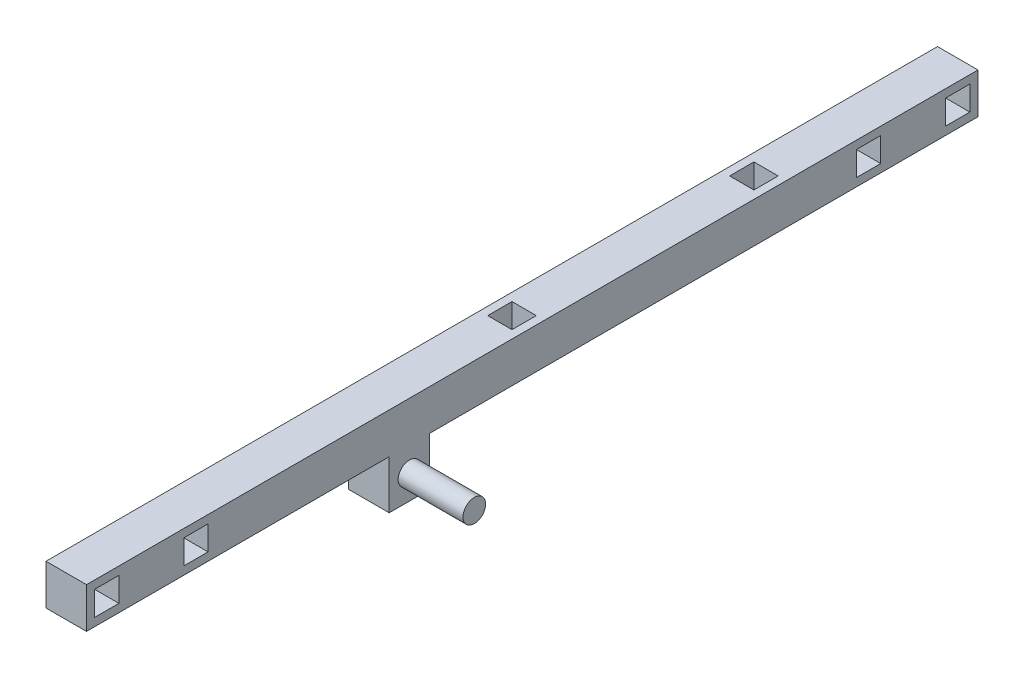
ISO-10303-21;
HEADER;
FILE_DESCRIPTION(('STEP AP214'),'2;1');
FILE_NAME('part.step','',(''),(''),'','','');
FILE_SCHEMA(('AUTOMOTIVE_DESIGN { 1 0 10303 214 1 1 1 1 }'));
ENDSEC;
DATA;
#1=APPLICATION_CONTEXT('core data for automotive mechanical design processes');
#2=APPLICATION_PROTOCOL_DEFINITION('international standard','automotive_design',2000,#1);
#3=PRODUCT_CONTEXT('',#1,'mechanical');
#4=PRODUCT('Part','Part','',(#3));
#5=PRODUCT_RELATED_PRODUCT_CATEGORY('part','',(#4));
#6=PRODUCT_DEFINITION_FORMATION('','',#4);
#7=PRODUCT_DEFINITION_CONTEXT('part definition',#1,'design');
#8=PRODUCT_DEFINITION('design','',#6,#7);
#9=PRODUCT_DEFINITION_SHAPE('','',#8);
#10=(LENGTH_UNIT() NAMED_UNIT(*) SI_UNIT(.MILLI.,.METRE.));
#11=(NAMED_UNIT(*) PLANE_ANGLE_UNIT() SI_UNIT($,.RADIAN.));
#12=(NAMED_UNIT(*) SI_UNIT($,.STERADIAN.) SOLID_ANGLE_UNIT());
#13=UNCERTAINTY_MEASURE_WITH_UNIT(LENGTH_MEASURE(1.E-05),#10,'distance_accuracy_value','');
#14=(GEOMETRIC_REPRESENTATION_CONTEXT(3) GLOBAL_UNCERTAINTY_ASSIGNED_CONTEXT((#13)) GLOBAL_UNIT_ASSIGNED_CONTEXT((#10,
#11,#12)) REPRESENTATION_CONTEXT('',''));
#15=CARTESIAN_POINT('',(0.,0.,0.));
#16=DIRECTION('',(0.,0.,1.));
#17=DIRECTION('',(1.,0.,0.));
#18=AXIS2_PLACEMENT_3D('',#15,#16,#17);
#19=CARTESIAN_POINT('',(0.,0.,110.));
#20=DIRECTION('',(0.,1.,0.));
#21=DIRECTION('',(0.,0.,1.));
#22=AXIS2_PLACEMENT_3D('',#19,#20,#21);
#23=PLANE('',#22);
#24=DIRECTION('',(-1.,0.,0.));
#25=VECTOR('',#24,1.);
#26=CARTESIAN_POINT('',(0.,0.,53.5));
#27=LINE('',#26,#25);
#28=CARTESIAN_POINT('',(4.00000000000001,0.,53.5));
#29=VERTEX_POINT('',#28);
#30=CARTESIAN_POINT('',(1.00000000000001,0.,53.5));
#31=VERTEX_POINT('',#30);
#32=EDGE_CURVE('E318',#29,#31,#27,.T.);
#33=ORIENTED_EDGE('',*,*,#32,.T.);
#34=DIRECTION('',(0.,0.,1.));
#35=VECTOR('',#34,1.);
#36=CARTESIAN_POINT('',(0.99999999999999,0.,110.));
#37=LINE('',#36,#35);
#38=CARTESIAN_POINT('',(1.00000000000001,0.,56.5));
#39=VERTEX_POINT('',#38);
#40=EDGE_CURVE('E321',#31,#39,#37,.T.);
#41=ORIENTED_EDGE('',*,*,#40,.T.);
#42=DIRECTION('',(1.,0.,0.));
#43=VECTOR('',#42,1.);
#44=CARTESIAN_POINT('',(0.,0.,56.5));
#45=LINE('',#44,#43);
#46=CARTESIAN_POINT('',(4.00000000000001,0.,56.5));
#47=VERTEX_POINT('',#46);
#48=EDGE_CURVE('E290',#39,#47,#45,.T.);
#49=ORIENTED_EDGE('',*,*,#48,.T.);
#50=DIRECTION('',(0.,0.,-1.));
#51=VECTOR('',#50,1.);
#52=CARTESIAN_POINT('',(4.,0.,110.));
#53=LINE('',#52,#51);
#54=EDGE_CURVE('E315',#47,#29,#53,.T.);
#55=ORIENTED_EDGE('',*,*,#54,.T.);
#56=EDGE_LOOP('',(#33,#41,#49,#55));
#57=FACE_BOUND('',#56,.T.);
#58=DIRECTION('',(-1.,0.,0.));
#59=VECTOR('',#58,1.);
#60=CARTESIAN_POINT('',(0.,0.,23.65));
#61=LINE('',#60,#59);
#62=CARTESIAN_POINT('',(4.,0.,23.65));
#63=VERTEX_POINT('',#62);
#64=CARTESIAN_POINT('',(0.999999999999999,0.,23.65));
#65=VERTEX_POINT('',#64);
#66=EDGE_CURVE('E330',#63,#65,#61,.T.);
#67=ORIENTED_EDGE('',*,*,#66,.T.);
#68=DIRECTION('',(0.,0.,1.));
#69=VECTOR('',#68,1.);
#70=CARTESIAN_POINT('',(1.00000000000001,0.,110.));
#71=LINE('',#70,#69);
#72=CARTESIAN_POINT('',(0.999999999999999,0.,26.65));
#73=VERTEX_POINT('',#72);
#74=EDGE_CURVE('E333',#65,#73,#71,.T.);
#75=ORIENTED_EDGE('',*,*,#74,.T.);
#76=DIRECTION('',(1.,0.,0.));
#77=VECTOR('',#76,1.);
#78=CARTESIAN_POINT('',(0.,0.,26.65));
#79=LINE('',#78,#77);
#80=CARTESIAN_POINT('',(4.,0.,26.65));
#81=VERTEX_POINT('',#80);
#82=EDGE_CURVE('E324',#73,#81,#79,.T.);
#83=ORIENTED_EDGE('',*,*,#82,.T.);
#84=DIRECTION('',(0.,0.,-1.));
#85=VECTOR('',#84,1.);
#86=CARTESIAN_POINT('',(4.00000000000005,0.,110.));
#87=LINE('',#86,#85);
#88=EDGE_CURVE('E327',#81,#63,#87,.T.);
#89=ORIENTED_EDGE('',*,*,#88,.T.);
#90=EDGE_LOOP('',(#67,#75,#83,#89));
#91=FACE_BOUND('',#90,.T.);
#92=DIRECTION('',(1.,0.,0.));
#93=VECTOR('',#92,1.);
#94=CARTESIAN_POINT('',(5.,0.,67.65));
#95=LINE('',#94,#93);
#96=CARTESIAN_POINT('',(0.,0.,67.65));
#97=VERTEX_POINT('',#96);
#98=CARTESIAN_POINT('',(5.,0.,67.65));
#99=VERTEX_POINT('',#98);
#100=EDGE_CURVE('E49',#97,#99,#95,.T.);
#101=ORIENTED_EDGE('',*,*,#100,.F.);
#102=DIRECTION('',(0.,0.,-1.));
#103=VECTOR('',#102,1.);
#104=CARTESIAN_POINT('',(0.,0.,110.));
#105=LINE('',#104,#103);
#106=CARTESIAN_POINT('',(0.,0.,0.));
#107=VERTEX_POINT('',#106);
#108=EDGE_CURVE('E441',#97,#107,#105,.T.);
#109=ORIENTED_EDGE('',*,*,#108,.T.);
#110=DIRECTION('',(1.,0.,0.));
#111=VECTOR('',#110,1.);
#112=CARTESIAN_POINT('',(0.,0.,0.));
#113=LINE('',#112,#111);
#114=CARTESIAN_POINT('',(5.,0.,0.));
#115=VERTEX_POINT('',#114);
#116=EDGE_CURVE('E430',#107,#115,#113,.T.);
#117=ORIENTED_EDGE('',*,*,#116,.T.);
#118=DIRECTION('',(0.,0.,-1.));
#119=VECTOR('',#118,1.);
#120=CARTESIAN_POINT('',(5.,0.,110.));
#121=LINE('',#120,#119);
#122=EDGE_CURVE('E54',#99,#115,#121,.T.);
#123=ORIENTED_EDGE('',*,*,#122,.F.);
#124=EDGE_LOOP('',(#101,#109,#117,#123));
#125=FACE_BOUND('',#124,.T.);
#126=ADVANCED_FACE('F33',(#57,#91,#125),#23,.F.);
#127=DIRECTION('',(-1.,0.,0.));
#128=VECTOR('',#127,1.);
#129=CARTESIAN_POINT('',(5.,0.,72.65));
#130=LINE('',#129,#128);
#131=CARTESIAN_POINT('',(5.,0.,72.65));
#132=VERTEX_POINT('',#131);
#133=CARTESIAN_POINT('',(0.,0.,72.65));
#134=VERTEX_POINT('',#133);
#135=EDGE_CURVE('E648',#132,#134,#130,.T.);
#136=ORIENTED_EDGE('',*,*,#135,.F.);
#137=CARTESIAN_POINT('',(5.,0.,110.));
#138=VERTEX_POINT('',#137);
#139=EDGE_CURVE('E266',#138,#132,#121,.T.);
#140=ORIENTED_EDGE('',*,*,#139,.F.);
#141=DIRECTION('',(1.,0.,0.));
#142=VECTOR('',#141,1.);
#143=CARTESIAN_POINT('',(0.,0.,110.));
#144=LINE('',#143,#142);
#145=CARTESIAN_POINT('',(0.,0.,110.));
#146=VERTEX_POINT('',#145);
#147=EDGE_CURVE('E420',#146,#138,#144,.T.);
#148=ORIENTED_EDGE('',*,*,#147,.F.);
#149=EDGE_CURVE('E442',#146,#134,#105,.T.);
#150=ORIENTED_EDGE('',*,*,#149,.T.);
#151=EDGE_LOOP('',(#136,#140,#148,#150));
#152=FACE_BOUND('',#151,.T.);
#153=ADVANCED_FACE('F520',(#152),#23,.F.);
#154=CARTESIAN_POINT('',(0.,0.,110.));
#155=DIRECTION('',(1.,0.,0.));
#156=DIRECTION('',(0.,0.,-1.));
#157=AXIS2_PLACEMENT_3D('',#154,#155,#156);
#158=PLANE('',#157);
#159=DIRECTION('',(0.,0.,1.));
#160=VECTOR('',#159,1.);
#161=CARTESIAN_POINT('',(0.,1.,1.));
#162=LINE('',#161,#160);
#163=CARTESIAN_POINT('',(0.,1.,1.));
#164=VERTEX_POINT('',#163);
#165=CARTESIAN_POINT('',(0.,1.,4.));
#166=VERTEX_POINT('',#165);
#167=EDGE_CURVE('E339',#164,#166,#162,.T.);
#168=ORIENTED_EDGE('',*,*,#167,.F.);
#169=DIRECTION('',(0.,-1.,0.));
#170=VECTOR('',#169,1.);
#171=CARTESIAN_POINT('',(0.,1.,1.));
#172=LINE('',#171,#170);
#173=CARTESIAN_POINT('',(0.,4.,1.));
#174=VERTEX_POINT('',#173);
#175=EDGE_CURVE('E337',#174,#164,#172,.T.);
#176=ORIENTED_EDGE('',*,*,#175,.F.);
#177=DIRECTION('',(0.,0.,-1.));
#178=VECTOR('',#177,1.);
#179=CARTESIAN_POINT('',(0.,4.,1.));
#180=LINE('',#179,#178);
#181=CARTESIAN_POINT('',(0.,4.,4.));
#182=VERTEX_POINT('',#181);
#183=EDGE_CURVE('E346',#182,#174,#180,.T.);
#184=ORIENTED_EDGE('',*,*,#183,.F.);
#185=DIRECTION('',(0.,1.,0.));
#186=VECTOR('',#185,1.);
#187=CARTESIAN_POINT('',(0.,1.,4.));
#188=LINE('',#187,#186);
#189=EDGE_CURVE('E343',#166,#182,#188,.T.);
#190=ORIENTED_EDGE('',*,*,#189,.F.);
#191=EDGE_LOOP('',(#168,#176,#184,#190));
#192=FACE_BOUND('',#191,.T.);
#193=DIRECTION('',(0.,0.,1.));
#194=VECTOR('',#193,1.);
#195=CARTESIAN_POINT('',(0.,1.,95.));
#196=LINE('',#195,#194);
#197=CARTESIAN_POINT('',(0.,1.,95.));
#198=VERTEX_POINT('',#197);
#199=CARTESIAN_POINT('',(0.,1.,98.));
#200=VERTEX_POINT('',#199);
#201=EDGE_CURVE('E360',#198,#200,#196,.T.);
#202=ORIENTED_EDGE('',*,*,#201,.F.);
#203=DIRECTION('',(0.,-1.,0.));
#204=VECTOR('',#203,1.);
#205=CARTESIAN_POINT('',(0.,4.,95.));
#206=LINE('',#205,#204);
#207=CARTESIAN_POINT('',(0.,4.,95.));
#208=VERTEX_POINT('',#207);
#209=EDGE_CURVE('E336',#208,#198,#206,.T.);
#210=ORIENTED_EDGE('',*,*,#209,.F.);
#211=DIRECTION('',(0.,0.,-1.));
#212=VECTOR('',#211,1.);
#213=CARTESIAN_POINT('',(0.,4.,95.));
#214=LINE('',#213,#212);
#215=CARTESIAN_POINT('',(0.,4.,98.));
#216=VERTEX_POINT('',#215);
#217=EDGE_CURVE('E366',#216,#208,#214,.T.);
#218=ORIENTED_EDGE('',*,*,#217,.F.);
#219=DIRECTION('',(0.,1.,0.));
#220=VECTOR('',#219,1.);
#221=CARTESIAN_POINT('',(0.,4.,98.));
#222=LINE('',#221,#220);
#223=EDGE_CURVE('E363',#200,#216,#222,.T.);
#224=ORIENTED_EDGE('',*,*,#223,.F.);
#225=EDGE_LOOP('',(#202,#210,#218,#224));
#226=FACE_BOUND('',#225,.T.);
#227=DIRECTION('',(0.,0.,1.));
#228=VECTOR('',#227,1.);
#229=CARTESIAN_POINT('',(0.,1.,12.));
#230=LINE('',#229,#228);
#231=CARTESIAN_POINT('',(0.,1.,12.));
#232=VERTEX_POINT('',#231);
#233=CARTESIAN_POINT('',(0.,1.,15.));
#234=VERTEX_POINT('',#233);
#235=EDGE_CURVE('E400',#232,#234,#230,.T.);
#236=ORIENTED_EDGE('',*,*,#235,.F.);
#237=DIRECTION('',(0.,-1.,0.));
#238=VECTOR('',#237,1.);
#239=CARTESIAN_POINT('',(0.,4.,12.));
#240=LINE('',#239,#238);
#241=CARTESIAN_POINT('',(0.,4.,12.));
#242=VERTEX_POINT('',#241);
#243=EDGE_CURVE('E372',#242,#232,#240,.T.);
#244=ORIENTED_EDGE('',*,*,#243,.F.);
#245=DIRECTION('',(0.,0.,-1.));
#246=VECTOR('',#245,1.);
#247=CARTESIAN_POINT('',(0.,4.,12.));
#248=LINE('',#247,#246);
#249=CARTESIAN_POINT('',(0.,4.,15.));
#250=VERTEX_POINT('',#249);
#251=EDGE_CURVE('E406',#250,#242,#248,.T.);
#252=ORIENTED_EDGE('',*,*,#251,.F.);
#253=DIRECTION('',(0.,1.,0.));
#254=VECTOR('',#253,1.);
#255=CARTESIAN_POINT('',(0.,4.,15.));
#256=LINE('',#255,#254);
#257=EDGE_CURVE('E403',#234,#250,#256,.T.);
#258=ORIENTED_EDGE('',*,*,#257,.F.);
#259=EDGE_LOOP('',(#236,#244,#252,#258));
#260=FACE_BOUND('',#259,.T.);
#261=DIRECTION('',(0.,0.,-1.));
#262=VECTOR('',#261,1.);
#263=CARTESIAN_POINT('',(0.,4.,109.));
#264=LINE('',#263,#262);
#265=CARTESIAN_POINT('',(0.,4.,109.));
#266=VERTEX_POINT('',#265);
#267=CARTESIAN_POINT('',(0.,4.,106.));
#268=VERTEX_POINT('',#267);
#269=EDGE_CURVE('E381',#266,#268,#264,.T.);
#270=ORIENTED_EDGE('',*,*,#269,.F.);
#271=DIRECTION('',(0.,1.,0.));
#272=VECTOR('',#271,1.);
#273=CARTESIAN_POINT('',(0.,4.,109.));
#274=LINE('',#273,#272);
#275=CARTESIAN_POINT('',(0.,1.,109.));
#276=VERTEX_POINT('',#275);
#277=EDGE_CURVE('E379',#276,#266,#274,.T.);
#278=ORIENTED_EDGE('',*,*,#277,.F.);
#279=DIRECTION('',(0.,0.,1.));
#280=VECTOR('',#279,1.);
#281=CARTESIAN_POINT('',(0.,1.,109.));
#282=LINE('',#281,#280);
#283=CARTESIAN_POINT('',(0.,1.,106.));
#284=VERTEX_POINT('',#283);
#285=EDGE_CURVE('E388',#284,#276,#282,.T.);
#286=ORIENTED_EDGE('',*,*,#285,.F.);
#287=DIRECTION('',(0.,-1.,0.));
#288=VECTOR('',#287,1.);
#289=CARTESIAN_POINT('',(0.,4.,106.));
#290=LINE('',#289,#288);
#291=EDGE_CURVE('E385',#268,#284,#290,.T.);
#292=ORIENTED_EDGE('',*,*,#291,.F.);
#293=EDGE_LOOP('',(#270,#278,#286,#292));
#294=FACE_BOUND('',#293,.T.);
#295=DIRECTION('',(0.,-1.,0.));
#296=VECTOR('',#295,1.);
#297=CARTESIAN_POINT('',(0.,0.,0.));
#298=LINE('',#297,#296);
#299=CARTESIAN_POINT('',(0.,5.,0.));
#300=VERTEX_POINT('',#299);
#301=EDGE_CURVE('E352',#300,#107,#298,.T.);
#302=ORIENTED_EDGE('',*,*,#301,.T.);
#303=ORIENTED_EDGE('',*,*,#108,.F.);
#304=DIRECTION('',(0.,1.,0.));
#305=VECTOR('',#304,1.);
#306=CARTESIAN_POINT('',(0.,-6.,67.65));
#307=LINE('',#306,#305);
#308=CARTESIAN_POINT('',(0.,-6.,67.65));
#309=VERTEX_POINT('',#308);
#310=EDGE_CURVE('E271',#309,#97,#307,.T.);
#311=ORIENTED_EDGE('',*,*,#310,.F.);
#312=DIRECTION('',(0.,0.,-1.));
#313=VECTOR('',#312,1.);
#314=CARTESIAN_POINT('',(0.,-6.,67.65));
#315=LINE('',#314,#313);
#316=CARTESIAN_POINT('',(0.,-6.,72.65));
#317=VERTEX_POINT('',#316);
#318=EDGE_CURVE('E251',#317,#309,#315,.T.);
#319=ORIENTED_EDGE('',*,*,#318,.F.);
#320=DIRECTION('',(0.,1.,0.));
#321=VECTOR('',#320,1.);
#322=CARTESIAN_POINT('',(0.,-6.,72.65));
#323=LINE('',#322,#321);
#324=EDGE_CURVE('E248',#317,#134,#323,.T.);
#325=ORIENTED_EDGE('',*,*,#324,.T.);
#326=ORIENTED_EDGE('',*,*,#149,.F.);
#327=DIRECTION('',(0.,-1.,0.));
#328=VECTOR('',#327,1.);
#329=CARTESIAN_POINT('',(0.,0.,110.));
#330=LINE('',#329,#328);
#331=CARTESIAN_POINT('',(0.,5.,110.));
#332=VERTEX_POINT('',#331);
#333=EDGE_CURVE('E417',#332,#146,#330,.T.);
#334=ORIENTED_EDGE('',*,*,#333,.F.);
#335=DIRECTION('',(0.,0.,-1.));
#336=VECTOR('',#335,1.);
#337=CARTESIAN_POINT('',(0.,5.,110.));
#338=LINE('',#337,#336);
#339=EDGE_CURVE('E427',#332,#300,#338,.T.);
#340=ORIENTED_EDGE('',*,*,#339,.T.);
#341=EDGE_LOOP('',(#302,#303,#311,#319,#325,#326,#334,#340));
#342=FACE_BOUND('',#341,.T.);
#343=ADVANCED_FACE('F35',(#192,#226,#260,#294,#342),#158,.F.);
#344=CARTESIAN_POINT('',(5.,0.,110.));
#345=DIRECTION('',(-1.,0.,0.));
#346=DIRECTION('',(0.,0.,1.));
#347=AXIS2_PLACEMENT_3D('',#344,#345,#346);
#348=PLANE('',#347);
#349=CARTESIAN_POINT('',(5.,-3.,70.15));
#350=DIRECTION('',(-1.,0.,0.));
#351=DIRECTION('',(0.,0.,1.));
#352=AXIS2_PLACEMENT_3D('',#349,#350,#351);
#353=CIRCLE('',#352,1.4);
#354=CARTESIAN_POINT('',(5.,-3.,71.55));
#355=VERTEX_POINT('',#354);
#356=EDGE_CURVE('E37',#355,#355,#353,.T.);
#357=ORIENTED_EDGE('',*,*,#356,.T.);
#358=EDGE_LOOP('',(#357));
#359=FACE_BOUND('',#358,.T.);
#360=DIRECTION('',(0.,0.,-1.));
#361=VECTOR('',#360,1.);
#362=CARTESIAN_POINT('',(5.,4.,110.));
#363=LINE('',#362,#361);
#364=CARTESIAN_POINT('',(5.,4.,4.));
#365=VERTEX_POINT('',#364);
#366=CARTESIAN_POINT('',(5.,4.,1.));
#367=VERTEX_POINT('',#366);
#368=EDGE_CURVE('E42',#365,#367,#363,.T.);
#369=ORIENTED_EDGE('',*,*,#368,.T.);
#370=DIRECTION('',(0.,-1.,0.));
#371=VECTOR('',#370,1.);
#372=CARTESIAN_POINT('',(5.,0.,1.));
#373=LINE('',#372,#371);
#374=CARTESIAN_POINT('',(5.,1.,1.));
#375=VERTEX_POINT('',#374);
#376=EDGE_CURVE('E11',#367,#375,#373,.T.);
#377=ORIENTED_EDGE('',*,*,#376,.T.);
#378=DIRECTION('',(0.,0.,1.));
#379=VECTOR('',#378,1.);
#380=CARTESIAN_POINT('',(5.,1.,110.));
#381=LINE('',#380,#379);
#382=CARTESIAN_POINT('',(5.,1.,4.));
#383=VERTEX_POINT('',#382);
#384=EDGE_CURVE('E480',#375,#383,#381,.T.);
#385=ORIENTED_EDGE('',*,*,#384,.T.);
#386=DIRECTION('',(0.,1.,0.));
#387=VECTOR('',#386,1.);
#388=CARTESIAN_POINT('',(5.,0.,4.));
#389=LINE('',#388,#387);
#390=EDGE_CURVE('E483',#383,#365,#389,.T.);
#391=ORIENTED_EDGE('',*,*,#390,.T.);
#392=EDGE_LOOP('',(#369,#377,#385,#391));
#393=FACE_BOUND('',#392,.T.);
#394=DIRECTION('',(0.,0.,-1.));
#395=VECTOR('',#394,1.);
#396=CARTESIAN_POINT('',(5.,4.,110.));
#397=LINE('',#396,#395);
#398=CARTESIAN_POINT('',(5.,4.,98.));
#399=VERTEX_POINT('',#398);
#400=CARTESIAN_POINT('',(5.,4.,95.));
#401=VERTEX_POINT('',#400);
#402=EDGE_CURVE('E474',#399,#401,#397,.T.);
#403=ORIENTED_EDGE('',*,*,#402,.T.);
#404=DIRECTION('',(0.,-1.,0.));
#405=VECTOR('',#404,1.);
#406=CARTESIAN_POINT('',(5.,0.,95.));
#407=LINE('',#406,#405);
#408=CARTESIAN_POINT('',(5.,1.,95.));
#409=VERTEX_POINT('',#408);
#410=EDGE_CURVE('E477',#401,#409,#407,.T.);
#411=ORIENTED_EDGE('',*,*,#410,.T.);
#412=DIRECTION('',(0.,0.,1.));
#413=VECTOR('',#412,1.);
#414=CARTESIAN_POINT('',(5.,1.,110.));
#415=LINE('',#414,#413);
#416=CARTESIAN_POINT('',(5.,1.,98.));
#417=VERTEX_POINT('',#416);
#418=EDGE_CURVE('E468',#409,#417,#415,.T.);
#419=ORIENTED_EDGE('',*,*,#418,.T.);
#420=DIRECTION('',(0.,1.,0.));
#421=VECTOR('',#420,1.);
#422=CARTESIAN_POINT('',(5.,0.,98.));
#423=LINE('',#422,#421);
#424=EDGE_CURVE('E471',#417,#399,#423,.T.);
#425=ORIENTED_EDGE('',*,*,#424,.T.);
#426=EDGE_LOOP('',(#403,#411,#419,#425));
#427=FACE_BOUND('',#426,.T.);
#428=DIRECTION('',(0.,0.,-1.));
#429=VECTOR('',#428,1.);
#430=CARTESIAN_POINT('',(5.,4.,110.));
#431=LINE('',#430,#429);
#432=CARTESIAN_POINT('',(5.,4.,15.));
#433=VERTEX_POINT('',#432);
#434=CARTESIAN_POINT('',(5.,4.,12.));
#435=VERTEX_POINT('',#434);
#436=EDGE_CURVE('E462',#433,#435,#431,.T.);
#437=ORIENTED_EDGE('',*,*,#436,.T.);
#438=DIRECTION('',(0.,-1.,0.));
#439=VECTOR('',#438,1.);
#440=CARTESIAN_POINT('',(5.,0.,12.));
#441=LINE('',#440,#439);
#442=CARTESIAN_POINT('',(5.,1.,12.));
#443=VERTEX_POINT('',#442);
#444=EDGE_CURVE('E465',#435,#443,#441,.T.);
#445=ORIENTED_EDGE('',*,*,#444,.T.);
#446=DIRECTION('',(0.,0.,1.));
#447=VECTOR('',#446,1.);
#448=CARTESIAN_POINT('',(5.,1.,110.));
#449=LINE('',#448,#447);
#450=CARTESIAN_POINT('',(5.,1.,15.));
#451=VERTEX_POINT('',#450);
#452=EDGE_CURVE('E456',#443,#451,#449,.T.);
#453=ORIENTED_EDGE('',*,*,#452,.T.);
#454=DIRECTION('',(0.,1.,0.));
#455=VECTOR('',#454,1.);
#456=CARTESIAN_POINT('',(5.,0.,15.));
#457=LINE('',#456,#455);
#458=EDGE_CURVE('E459',#451,#433,#457,.T.);
#459=ORIENTED_EDGE('',*,*,#458,.T.);
#460=EDGE_LOOP('',(#437,#445,#453,#459));
#461=FACE_BOUND('',#460,.T.);
#462=DIRECTION('',(0.,0.,1.));
#463=VECTOR('',#462,1.);
#464=CARTESIAN_POINT('',(5.,1.,110.));
#465=LINE('',#464,#463);
#466=CARTESIAN_POINT('',(5.,1.,106.));
#467=VERTEX_POINT('',#466);
#468=CARTESIAN_POINT('',(5.,1.,109.));
#469=VERTEX_POINT('',#468);
#470=EDGE_CURVE('E450',#467,#469,#465,.T.);
#471=ORIENTED_EDGE('',*,*,#470,.T.);
#472=DIRECTION('',(0.,1.,0.));
#473=VECTOR('',#472,1.);
#474=CARTESIAN_POINT('',(5.,0.,109.));
#475=LINE('',#474,#473);
#476=CARTESIAN_POINT('',(5.,4.,109.));
#477=VERTEX_POINT('',#476);
#478=EDGE_CURVE('E453',#469,#477,#475,.T.);
#479=ORIENTED_EDGE('',*,*,#478,.T.);
#480=DIRECTION('',(0.,0.,-1.));
#481=VECTOR('',#480,1.);
#482=CARTESIAN_POINT('',(5.,4.,110.));
#483=LINE('',#482,#481);
#484=CARTESIAN_POINT('',(5.,4.,106.));
#485=VERTEX_POINT('',#484);
#486=EDGE_CURVE('E444',#477,#485,#483,.T.);
#487=ORIENTED_EDGE('',*,*,#486,.T.);
#488=DIRECTION('',(0.,-1.,0.));
#489=VECTOR('',#488,1.);
#490=CARTESIAN_POINT('',(5.,0.,106.));
#491=LINE('',#490,#489);
#492=EDGE_CURVE('E447',#485,#467,#491,.T.);
#493=ORIENTED_EDGE('',*,*,#492,.T.);
#494=EDGE_LOOP('',(#471,#479,#487,#493));
#495=FACE_BOUND('',#494,.T.);
#496=DIRECTION('',(0.,1.,0.));
#497=VECTOR('',#496,1.);
#498=CARTESIAN_POINT('',(5.,0.,0.));
#499=LINE('',#498,#497);
#500=CARTESIAN_POINT('',(5.,5.,0.));
#501=VERTEX_POINT('',#500);
#502=EDGE_CURVE('E432',#115,#501,#499,.T.);
#503=ORIENTED_EDGE('',*,*,#502,.T.);
#504=DIRECTION('',(0.,0.,-1.));
#505=VECTOR('',#504,1.);
#506=CARTESIAN_POINT('',(5.,5.,110.));
#507=LINE('',#506,#505);
#508=CARTESIAN_POINT('',(5.,5.,110.));
#509=VERTEX_POINT('',#508);
#510=EDGE_CURVE('E437',#509,#501,#507,.T.);
#511=ORIENTED_EDGE('',*,*,#510,.F.);
#512=DIRECTION('',(0.,1.,0.));
#513=VECTOR('',#512,1.);
#514=CARTESIAN_POINT('',(5.,0.,110.));
#515=LINE('',#514,#513);
#516=EDGE_CURVE('E423',#138,#509,#515,.T.);
#517=ORIENTED_EDGE('',*,*,#516,.F.);
#518=ORIENTED_EDGE('',*,*,#139,.T.);
#519=DIRECTION('',(0.,1.,0.));
#520=VECTOR('',#519,1.);
#521=CARTESIAN_POINT('',(5.,-6.,72.65));
#522=LINE('',#521,#520);
#523=CARTESIAN_POINT('',(5.,-6.,72.65));
#524=VERTEX_POINT('',#523);
#525=EDGE_CURVE('E246',#524,#132,#522,.T.);
#526=ORIENTED_EDGE('',*,*,#525,.F.);
#527=DIRECTION('',(0.,0.,1.));
#528=VECTOR('',#527,1.);
#529=CARTESIAN_POINT('',(5.,-6.,67.65));
#530=LINE('',#529,#528);
#531=CARTESIAN_POINT('',(5.,-6.,67.65));
#532=VERTEX_POINT('',#531);
#533=EDGE_CURVE('E252',#532,#524,#530,.T.);
#534=ORIENTED_EDGE('',*,*,#533,.F.);
#535=DIRECTION('',(0.,1.,0.));
#536=VECTOR('',#535,1.);
#537=CARTESIAN_POINT('',(5.,-6.,67.65));
#538=LINE('',#537,#536);
#539=EDGE_CURVE('E652',#532,#99,#538,.T.);
#540=ORIENTED_EDGE('',*,*,#539,.T.);
#541=ORIENTED_EDGE('',*,*,#122,.T.);
#542=EDGE_LOOP('',(#503,#511,#517,#518,#526,#534,#540,#541));
#543=FACE_BOUND('',#542,.T.);
#544=ADVANCED_FACE('F263',(#359,#393,#427,#461,#495,#543),#348,.F.);
#545=CARTESIAN_POINT('',(0.,5.,110.));
#546=DIRECTION('',(0.,-1.,0.));
#547=DIRECTION('',(0.,0.,-1.));
#548=AXIS2_PLACEMENT_3D('',#545,#546,#547);
#549=PLANE('',#548);
#550=DIRECTION('',(1.,0.,0.));
#551=VECTOR('',#550,1.);
#552=CARTESIAN_POINT('',(0.999999999999999,5.,26.65));
#553=LINE('',#552,#551);
#554=CARTESIAN_POINT('',(0.999999999999999,5.,26.65));
#555=VERTEX_POINT('',#554);
#556=CARTESIAN_POINT('',(4.,5.,26.65));
#557=VERTEX_POINT('',#556);
#558=EDGE_CURVE('E277',#555,#557,#553,.T.);
#559=ORIENTED_EDGE('',*,*,#558,.F.);
#560=DIRECTION('',(0.,0.,1.));
#561=VECTOR('',#560,1.);
#562=CARTESIAN_POINT('',(0.999999999999999,5.,23.65));
#563=LINE('',#562,#561);
#564=CARTESIAN_POINT('',(0.999999999999999,5.,23.65));
#565=VERTEX_POINT('',#564);
#566=EDGE_CURVE('E275',#565,#555,#563,.T.);
#567=ORIENTED_EDGE('',*,*,#566,.F.);
#568=DIRECTION('',(-1.,0.,0.));
#569=VECTOR('',#568,1.);
#570=CARTESIAN_POINT('',(0.999999999999999,5.,23.65));
#571=LINE('',#570,#569);
#572=CARTESIAN_POINT('',(4.,5.,23.65));
#573=VERTEX_POINT('',#572);
#574=EDGE_CURVE('E284',#573,#565,#571,.T.);
#575=ORIENTED_EDGE('',*,*,#574,.F.);
#576=DIRECTION('',(0.,0.,-1.));
#577=VECTOR('',#576,1.);
#578=CARTESIAN_POINT('',(4.,5.,23.65));
#579=LINE('',#578,#577);
#580=EDGE_CURVE('E281',#557,#573,#579,.T.);
#581=ORIENTED_EDGE('',*,*,#580,.F.);
#582=EDGE_LOOP('',(#559,#567,#575,#581));
#583=FACE_BOUND('',#582,.T.);
#584=DIRECTION('',(1.,0.,0.));
#585=VECTOR('',#584,1.);
#586=CARTESIAN_POINT('',(1.00000000000001,5.,56.5));
#587=LINE('',#586,#585);
#588=CARTESIAN_POINT('',(1.00000000000001,5.,56.5));
#589=VERTEX_POINT('',#588);
#590=CARTESIAN_POINT('',(4.00000000000001,5.,56.5));
#591=VERTEX_POINT('',#590);
#592=EDGE_CURVE('E269',#589,#591,#587,.T.);
#593=ORIENTED_EDGE('',*,*,#592,.F.);
#594=DIRECTION('',(0.,0.,1.));
#595=VECTOR('',#594,1.);
#596=CARTESIAN_POINT('',(1.00000000000001,5.,53.5));
#597=LINE('',#596,#595);
#598=CARTESIAN_POINT('',(1.00000000000001,5.,53.5));
#599=VERTEX_POINT('',#598);
#600=EDGE_CURVE('E267',#599,#589,#597,.T.);
#601=ORIENTED_EDGE('',*,*,#600,.F.);
#602=DIRECTION('',(-1.,0.,0.));
#603=VECTOR('',#602,1.);
#604=CARTESIAN_POINT('',(1.00000000000001,5.,53.5));
#605=LINE('',#604,#603);
#606=CARTESIAN_POINT('',(4.00000000000001,5.,53.5));
#607=VERTEX_POINT('',#606);
#608=EDGE_CURVE('E302',#607,#599,#605,.T.);
#609=ORIENTED_EDGE('',*,*,#608,.F.);
#610=DIRECTION('',(0.,0.,-1.));
#611=VECTOR('',#610,1.);
#612=CARTESIAN_POINT('',(4.00000000000001,5.,53.5));
#613=LINE('',#612,#611);
#614=EDGE_CURVE('E299',#591,#607,#613,.T.);
#615=ORIENTED_EDGE('',*,*,#614,.F.);
#616=EDGE_LOOP('',(#593,#601,#609,#615));
#617=FACE_BOUND('',#616,.T.);
#618=DIRECTION('',(-1.,0.,0.));
#619=VECTOR('',#618,1.);
#620=CARTESIAN_POINT('',(0.,5.,0.));
#621=LINE('',#620,#619);
#622=EDGE_CURVE('E421',#501,#300,#621,.T.);
#623=ORIENTED_EDGE('',*,*,#622,.T.);
#624=ORIENTED_EDGE('',*,*,#339,.F.);
#625=DIRECTION('',(-1.,0.,0.));
#626=VECTOR('',#625,1.);
#627=CARTESIAN_POINT('',(0.,5.,110.));
#628=LINE('',#627,#626);
#629=EDGE_CURVE('E425',#509,#332,#628,.T.);
#630=ORIENTED_EDGE('',*,*,#629,.F.);
#631=ORIENTED_EDGE('',*,*,#510,.T.);
#632=EDGE_LOOP('',(#623,#624,#630,#631));
#633=FACE_BOUND('',#632,.T.);
#634=ADVANCED_FACE('F531',(#583,#617,#633),#549,.F.);
#635=CARTESIAN_POINT('',(0.,0.,110.));
#636=DIRECTION('',(0.,0.,-1.));
#637=DIRECTION('',(-1.,0.,0.));
#638=AXIS2_PLACEMENT_3D('',#635,#636,#637);
#639=PLANE('',#638);
#640=ORIENTED_EDGE('',*,*,#333,.T.);
#641=ORIENTED_EDGE('',*,*,#147,.T.);
#642=ORIENTED_EDGE('',*,*,#516,.T.);
#643=ORIENTED_EDGE('',*,*,#629,.T.);
#644=EDGE_LOOP('',(#640,#641,#642,#643));
#645=FACE_BOUND('',#644,.T.);
#646=ADVANCED_FACE('F535',(#645),#639,.F.);
#647=CARTESIAN_POINT('',(0.,0.,0.));
#648=DIRECTION('',(0.,0.,-1.));
#649=DIRECTION('',(-1.,0.,0.));
#650=AXIS2_PLACEMENT_3D('',#647,#648,#649);
#651=PLANE('',#650);
#652=ORIENTED_EDGE('',*,*,#301,.F.);
#653=ORIENTED_EDGE('',*,*,#622,.F.);
#654=ORIENTED_EDGE('',*,*,#502,.F.);
#655=ORIENTED_EDGE('',*,*,#116,.F.);
#656=EDGE_LOOP('',(#652,#653,#654,#655));
#657=FACE_BOUND('',#656,.T.);
#658=ADVANCED_FACE('F537',(#657),#651,.T.);
#659=CARTESIAN_POINT('',(8.99999999999995,4.,109.));
#660=DIRECTION('',(0.,0.,1.));
#661=DIRECTION('',(0.,-1.,0.));
#662=AXIS2_PLACEMENT_3D('',#659,#660,#661);
#663=PLANE('',#662);
#664=DIRECTION('',(-1.,0.,0.));
#665=VECTOR('',#664,1.);
#666=CARTESIAN_POINT('',(8.99999999999995,1.,109.));
#667=LINE('',#666,#665);
#668=EDGE_CURVE('E340',#469,#276,#667,.T.);
#669=ORIENTED_EDGE('',*,*,#668,.T.);
#670=ORIENTED_EDGE('',*,*,#277,.T.);
#671=DIRECTION('',(-1.,0.,0.));
#672=VECTOR('',#671,1.);
#673=CARTESIAN_POINT('',(8.99999999999995,4.,109.));
#674=LINE('',#673,#672);
#675=EDGE_CURVE('E391',#477,#266,#674,.T.);
#676=ORIENTED_EDGE('',*,*,#675,.F.);
#677=ORIENTED_EDGE('',*,*,#478,.F.);
#678=EDGE_LOOP('',(#669,#670,#676,#677));
#679=FACE_BOUND('',#678,.T.);
#680=ADVANCED_FACE('F540',(#679),#663,.F.);
#681=CARTESIAN_POINT('',(8.99999999999995,1.,109.));
#682=DIRECTION('',(0.,-1.,0.));
#683=DIRECTION('',(0.,0.,-1.));
#684=AXIS2_PLACEMENT_3D('',#681,#682,#683);
#685=PLANE('',#684);
#686=DIRECTION('',(-1.,0.,0.));
#687=VECTOR('',#686,1.);
#688=CARTESIAN_POINT('',(8.99999999999995,1.,106.));
#689=LINE('',#688,#687);
#690=EDGE_CURVE('E393',#467,#284,#689,.T.);
#691=ORIENTED_EDGE('',*,*,#690,.T.);
#692=ORIENTED_EDGE('',*,*,#285,.T.);
#693=ORIENTED_EDGE('',*,*,#668,.F.);
#694=ORIENTED_EDGE('',*,*,#470,.F.);
#695=EDGE_LOOP('',(#691,#692,#693,#694));
#696=FACE_BOUND('',#695,.T.);
#697=ADVANCED_FACE('F565',(#696),#685,.F.);
#698=CARTESIAN_POINT('',(8.99999999999995,4.,106.));
#699=DIRECTION('',(0.,0.,-1.));
#700=DIRECTION('',(-1.,0.,0.));
#701=AXIS2_PLACEMENT_3D('',#698,#699,#700);
#702=PLANE('',#701);
#703=DIRECTION('',(-1.,0.,0.));
#704=VECTOR('',#703,1.);
#705=CARTESIAN_POINT('',(8.99999999999995,4.,106.));
#706=LINE('',#705,#704);
#707=EDGE_CURVE('E395',#485,#268,#706,.T.);
#708=ORIENTED_EDGE('',*,*,#707,.T.);
#709=ORIENTED_EDGE('',*,*,#291,.T.);
#710=ORIENTED_EDGE('',*,*,#690,.F.);
#711=ORIENTED_EDGE('',*,*,#492,.F.);
#712=EDGE_LOOP('',(#708,#709,#710,#711));
#713=FACE_BOUND('',#712,.T.);
#714=ADVANCED_FACE('F569',(#713),#702,.F.);
#715=CARTESIAN_POINT('',(8.99999999999995,4.,109.));
#716=DIRECTION('',(0.,1.,0.));
#717=DIRECTION('',(0.,0.,1.));
#718=AXIS2_PLACEMENT_3D('',#715,#716,#717);
#719=PLANE('',#718);
#720=ORIENTED_EDGE('',*,*,#675,.T.);
#721=ORIENTED_EDGE('',*,*,#269,.T.);
#722=ORIENTED_EDGE('',*,*,#707,.F.);
#723=ORIENTED_EDGE('',*,*,#486,.F.);
#724=EDGE_LOOP('',(#720,#721,#722,#723));
#725=FACE_BOUND('',#724,.T.);
#726=ADVANCED_FACE('F549',(#725),#719,.F.);
#727=CARTESIAN_POINT('',(8.99999999999995,4.,12.));
#728=DIRECTION('',(0.,0.,-1.));
#729=DIRECTION('',(-1.,0.,0.));
#730=AXIS2_PLACEMENT_3D('',#727,#728,#729);
#731=PLANE('',#730);
#732=DIRECTION('',(-1.,0.,0.));
#733=VECTOR('',#732,1.);
#734=CARTESIAN_POINT('',(8.99999999999995,4.,12.));
#735=LINE('',#734,#733);
#736=EDGE_CURVE('E382',#435,#242,#735,.T.);
#737=ORIENTED_EDGE('',*,*,#736,.T.);
#738=ORIENTED_EDGE('',*,*,#243,.T.);
#739=DIRECTION('',(-1.,0.,0.));
#740=VECTOR('',#739,1.);
#741=CARTESIAN_POINT('',(8.99999999999995,1.,12.));
#742=LINE('',#741,#740);
#743=EDGE_CURVE('E409',#443,#232,#742,.T.);
#744=ORIENTED_EDGE('',*,*,#743,.F.);
#745=ORIENTED_EDGE('',*,*,#444,.F.);
#746=EDGE_LOOP('',(#737,#738,#744,#745));
#747=FACE_BOUND('',#746,.T.);
#748=ADVANCED_FACE('F545',(#747),#731,.F.);
#749=CARTESIAN_POINT('',(8.99999999999995,4.,12.));
#750=DIRECTION('',(0.,1.,0.));
#751=DIRECTION('',(0.,0.,1.));
#752=AXIS2_PLACEMENT_3D('',#749,#750,#751);
#753=PLANE('',#752);
#754=DIRECTION('',(-1.,0.,0.));
#755=VECTOR('',#754,1.);
#756=CARTESIAN_POINT('',(8.99999999999995,4.,15.));
#757=LINE('',#756,#755);
#758=EDGE_CURVE('E411',#433,#250,#757,.T.);
#759=ORIENTED_EDGE('',*,*,#758,.T.);
#760=ORIENTED_EDGE('',*,*,#251,.T.);
#761=ORIENTED_EDGE('',*,*,#736,.F.);
#762=ORIENTED_EDGE('',*,*,#436,.F.);
#763=EDGE_LOOP('',(#759,#760,#761,#762));
#764=FACE_BOUND('',#763,.T.);
#765=ADVANCED_FACE('F548',(#764),#753,.F.);
#766=CARTESIAN_POINT('',(8.99999999999995,4.,15.));
#767=DIRECTION('',(0.,0.,1.));
#768=DIRECTION('',(1.,0.,0.));
#769=AXIS2_PLACEMENT_3D('',#766,#767,#768);
#770=PLANE('',#769);
#771=DIRECTION('',(-1.,0.,0.));
#772=VECTOR('',#771,1.);
#773=CARTESIAN_POINT('',(8.99999999999995,1.,15.));
#774=LINE('',#773,#772);
#775=EDGE_CURVE('E413',#451,#234,#774,.T.);
#776=ORIENTED_EDGE('',*,*,#775,.T.);
#777=ORIENTED_EDGE('',*,*,#257,.T.);
#778=ORIENTED_EDGE('',*,*,#758,.F.);
#779=ORIENTED_EDGE('',*,*,#458,.F.);
#780=EDGE_LOOP('',(#776,#777,#778,#779));
#781=FACE_BOUND('',#780,.T.);
#782=ADVANCED_FACE('F555',(#781),#770,.F.);
#783=CARTESIAN_POINT('',(8.99999999999995,1.,12.));
#784=DIRECTION('',(0.,-1.,0.));
#785=DIRECTION('',(0.,0.,-1.));
#786=AXIS2_PLACEMENT_3D('',#783,#784,#785);
#787=PLANE('',#786);
#788=ORIENTED_EDGE('',*,*,#743,.T.);
#789=ORIENTED_EDGE('',*,*,#235,.T.);
#790=ORIENTED_EDGE('',*,*,#775,.F.);
#791=ORIENTED_EDGE('',*,*,#452,.F.);
#792=EDGE_LOOP('',(#788,#789,#790,#791));
#793=FACE_BOUND('',#792,.T.);
#794=ADVANCED_FACE('F551',(#793),#787,.F.);
#795=CARTESIAN_POINT('',(8.99999999999995,4.,95.));
#796=DIRECTION('',(0.,0.,-1.));
#797=DIRECTION('',(-1.,0.,0.));
#798=AXIS2_PLACEMENT_3D('',#795,#796,#797);
#799=PLANE('',#798);
#800=DIRECTION('',(-1.,0.,0.));
#801=VECTOR('',#800,1.);
#802=CARTESIAN_POINT('',(8.99999999999995,4.,95.));
#803=LINE('',#802,#801);
#804=EDGE_CURVE('E370',#401,#208,#803,.T.);
#805=ORIENTED_EDGE('',*,*,#804,.T.);
#806=ORIENTED_EDGE('',*,*,#209,.T.);
#807=DIRECTION('',(-1.,0.,0.));
#808=VECTOR('',#807,1.);
#809=CARTESIAN_POINT('',(8.99999999999995,1.,95.));
#810=LINE('',#809,#808);
#811=EDGE_CURVE('E369',#409,#198,#810,.T.);
#812=ORIENTED_EDGE('',*,*,#811,.F.);
#813=ORIENTED_EDGE('',*,*,#410,.F.);
#814=EDGE_LOOP('',(#805,#806,#812,#813));
#815=FACE_BOUND('',#814,.T.);
#816=ADVANCED_FACE('F554',(#815),#799,.F.);
#817=CARTESIAN_POINT('',(8.99999999999995,4.,95.));
#818=DIRECTION('',(0.,1.,0.));
#819=DIRECTION('',(0.,0.,1.));
#820=AXIS2_PLACEMENT_3D('',#817,#818,#819);
#821=PLANE('',#820);
#822=DIRECTION('',(-1.,0.,0.));
#823=VECTOR('',#822,1.);
#824=CARTESIAN_POINT('',(8.99999999999995,4.,98.));
#825=LINE('',#824,#823);
#826=EDGE_CURVE('E373',#399,#216,#825,.T.);
#827=ORIENTED_EDGE('',*,*,#826,.T.);
#828=ORIENTED_EDGE('',*,*,#217,.T.);
#829=ORIENTED_EDGE('',*,*,#804,.F.);
#830=ORIENTED_EDGE('',*,*,#402,.F.);
#831=EDGE_LOOP('',(#827,#828,#829,#830));
#832=FACE_BOUND('',#831,.T.);
#833=ADVANCED_FACE('F579',(#832),#821,.F.);
#834=CARTESIAN_POINT('',(8.99999999999995,4.,98.));
#835=DIRECTION('',(0.,0.,1.));
#836=DIRECTION('',(1.,0.,0.));
#837=AXIS2_PLACEMENT_3D('',#834,#835,#836);
#838=PLANE('',#837);
#839=DIRECTION('',(-1.,0.,0.));
#840=VECTOR('',#839,1.);
#841=CARTESIAN_POINT('',(8.99999999999995,1.,98.));
#842=LINE('',#841,#840);
#843=EDGE_CURVE('E375',#417,#200,#842,.T.);
#844=ORIENTED_EDGE('',*,*,#843,.T.);
#845=ORIENTED_EDGE('',*,*,#223,.T.);
#846=ORIENTED_EDGE('',*,*,#826,.F.);
#847=ORIENTED_EDGE('',*,*,#424,.F.);
#848=EDGE_LOOP('',(#844,#845,#846,#847));
#849=FACE_BOUND('',#848,.T.);
#850=ADVANCED_FACE('F584',(#849),#838,.F.);
#851=CARTESIAN_POINT('',(8.99999999999995,1.,95.));
#852=DIRECTION('',(0.,-1.,0.));
#853=DIRECTION('',(0.,0.,-1.));
#854=AXIS2_PLACEMENT_3D('',#851,#852,#853);
#855=PLANE('',#854);
#856=ORIENTED_EDGE('',*,*,#811,.T.);
#857=ORIENTED_EDGE('',*,*,#201,.T.);
#858=ORIENTED_EDGE('',*,*,#843,.F.);
#859=ORIENTED_EDGE('',*,*,#418,.F.);
#860=EDGE_LOOP('',(#856,#857,#858,#859));
#861=FACE_BOUND('',#860,.T.);
#862=ADVANCED_FACE('F581',(#861),#855,.F.);
#863=CARTESIAN_POINT('',(8.99999999999995,1.,1.));
#864=DIRECTION('',(0.,0.,-1.));
#865=DIRECTION('',(-1.,0.,0.));
#866=AXIS2_PLACEMENT_3D('',#863,#864,#865);
#867=PLANE('',#866);
#868=DIRECTION('',(-1.,0.,0.));
#869=VECTOR('',#868,1.);
#870=CARTESIAN_POINT('',(8.99999999999995,4.,1.));
#871=LINE('',#870,#869);
#872=EDGE_CURVE('E350',#367,#174,#871,.T.);
#873=ORIENTED_EDGE('',*,*,#872,.T.);
#874=ORIENTED_EDGE('',*,*,#175,.T.);
#875=DIRECTION('',(-1.,0.,0.));
#876=VECTOR('',#875,1.);
#877=CARTESIAN_POINT('',(8.99999999999995,1.,1.));
#878=LINE('',#877,#876);
#879=EDGE_CURVE('E349',#375,#164,#878,.T.);
#880=ORIENTED_EDGE('',*,*,#879,.F.);
#881=ORIENTED_EDGE('',*,*,#376,.F.);
#882=EDGE_LOOP('',(#873,#874,#880,#881));
#883=FACE_BOUND('',#882,.T.);
#884=ADVANCED_FACE('F504',(#883),#867,.F.);
#885=CARTESIAN_POINT('',(8.99999999999995,4.,1.));
#886=DIRECTION('',(0.,1.,0.));
#887=DIRECTION('',(0.,0.,1.));
#888=AXIS2_PLACEMENT_3D('',#885,#886,#887);
#889=PLANE('',#888);
#890=DIRECTION('',(-1.,0.,0.));
#891=VECTOR('',#890,1.);
#892=CARTESIAN_POINT('',(8.99999999999995,4.,4.));
#893=LINE('',#892,#891);
#894=EDGE_CURVE('E353',#365,#182,#893,.T.);
#895=ORIENTED_EDGE('',*,*,#894,.T.);
#896=ORIENTED_EDGE('',*,*,#183,.T.);
#897=ORIENTED_EDGE('',*,*,#872,.F.);
#898=ORIENTED_EDGE('',*,*,#368,.F.);
#899=EDGE_LOOP('',(#895,#896,#897,#898));
#900=FACE_BOUND('',#899,.T.);
#901=ADVANCED_FACE('F493',(#900),#889,.F.);
#902=CARTESIAN_POINT('',(8.99999999999995,1.,4.));
#903=DIRECTION('',(0.,0.,1.));
#904=DIRECTION('',(1.,0.,0.));
#905=AXIS2_PLACEMENT_3D('',#902,#903,#904);
#906=PLANE('',#905);
#907=DIRECTION('',(-1.,0.,0.));
#908=VECTOR('',#907,1.);
#909=CARTESIAN_POINT('',(8.99999999999995,1.,4.));
#910=LINE('',#909,#908);
#911=EDGE_CURVE('E355',#383,#166,#910,.T.);
#912=ORIENTED_EDGE('',*,*,#911,.T.);
#913=ORIENTED_EDGE('',*,*,#189,.T.);
#914=ORIENTED_EDGE('',*,*,#894,.F.);
#915=ORIENTED_EDGE('',*,*,#390,.F.);
#916=EDGE_LOOP('',(#912,#913,#914,#915));
#917=FACE_BOUND('',#916,.T.);
#918=ADVANCED_FACE('F495',(#917),#906,.F.);
#919=CARTESIAN_POINT('',(8.99999999999995,1.,1.));
#920=DIRECTION('',(0.,-1.,0.));
#921=DIRECTION('',(0.,0.,-1.));
#922=AXIS2_PLACEMENT_3D('',#919,#920,#921);
#923=PLANE('',#922);
#924=ORIENTED_EDGE('',*,*,#879,.T.);
#925=ORIENTED_EDGE('',*,*,#167,.T.);
#926=ORIENTED_EDGE('',*,*,#911,.F.);
#927=ORIENTED_EDGE('',*,*,#384,.F.);
#928=EDGE_LOOP('',(#924,#925,#926,#927));
#929=FACE_BOUND('',#928,.T.);
#930=ADVANCED_FACE('F506',(#929),#923,.F.);
#931=CARTESIAN_POINT('',(1.00000000000001,-3.99999999999995,53.5));
#932=DIRECTION('',(-1.,0.,0.));
#933=DIRECTION('',(0.,0.,1.));
#934=AXIS2_PLACEMENT_3D('',#931,#932,#933);
#935=PLANE('',#934);
#936=DIRECTION('',(0.,1.,0.));
#937=VECTOR('',#936,1.);
#938=CARTESIAN_POINT('',(1.00000000000001,-3.99999999999995,53.5));
#939=LINE('',#938,#937);
#940=EDGE_CURVE('E278',#31,#599,#939,.T.);
#941=ORIENTED_EDGE('',*,*,#940,.T.);
#942=ORIENTED_EDGE('',*,*,#600,.T.);
#943=DIRECTION('',(0.,1.,0.));
#944=VECTOR('',#943,1.);
#945=CARTESIAN_POINT('',(1.00000000000001,-3.99999999999995,56.5));
#946=LINE('',#945,#944);
#947=EDGE_CURVE('E305',#39,#589,#946,.T.);
#948=ORIENTED_EDGE('',*,*,#947,.F.);
#949=ORIENTED_EDGE('',*,*,#40,.F.);
#950=EDGE_LOOP('',(#941,#942,#948,#949));
#951=FACE_BOUND('',#950,.T.);
#952=ADVANCED_FACE('F508',(#951),#935,.F.);
#953=CARTESIAN_POINT('',(1.00000000000001,-3.99999999999995,53.5));
#954=DIRECTION('',(0.,0.,-1.));
#955=DIRECTION('',(-1.,0.,0.));
#956=AXIS2_PLACEMENT_3D('',#953,#954,#955);
#957=PLANE('',#956);
#958=DIRECTION('',(0.,1.,0.));
#959=VECTOR('',#958,1.);
#960=CARTESIAN_POINT('',(4.00000000000001,-3.99999999999995,53.5));
#961=LINE('',#960,#959);
#962=EDGE_CURVE('E307',#29,#607,#961,.T.);
#963=ORIENTED_EDGE('',*,*,#962,.T.);
#964=ORIENTED_EDGE('',*,*,#608,.T.);
#965=ORIENTED_EDGE('',*,*,#940,.F.);
#966=ORIENTED_EDGE('',*,*,#32,.F.);
#967=EDGE_LOOP('',(#963,#964,#965,#966));
#968=FACE_BOUND('',#967,.T.);
#969=ADVANCED_FACE('F514',(#968),#957,.F.);
#970=CARTESIAN_POINT('',(4.00000000000001,-3.99999999999995,53.5));
#971=DIRECTION('',(1.,0.,0.));
#972=DIRECTION('',(0.,0.,-1.));
#973=AXIS2_PLACEMENT_3D('',#970,#971,#972);
#974=PLANE('',#973);
#975=DIRECTION('',(0.,1.,0.));
#976=VECTOR('',#975,1.);
#977=CARTESIAN_POINT('',(4.00000000000001,-3.99999999999995,56.5));
#978=LINE('',#977,#976);
#979=EDGE_CURVE('E309',#47,#591,#978,.T.);
#980=ORIENTED_EDGE('',*,*,#979,.T.);
#981=ORIENTED_EDGE('',*,*,#614,.T.);
#982=ORIENTED_EDGE('',*,*,#962,.F.);
#983=ORIENTED_EDGE('',*,*,#54,.F.);
#984=EDGE_LOOP('',(#980,#981,#982,#983));
#985=FACE_BOUND('',#984,.T.);
#986=ADVANCED_FACE('F603',(#985),#974,.F.);
#987=CARTESIAN_POINT('',(1.00000000000001,-3.99999999999995,56.5));
#988=DIRECTION('',(0.,0.,1.));
#989=DIRECTION('',(1.,0.,0.));
#990=AXIS2_PLACEMENT_3D('',#987,#988,#989);
#991=PLANE('',#990);
#992=ORIENTED_EDGE('',*,*,#947,.T.);
#993=ORIENTED_EDGE('',*,*,#592,.T.);
#994=ORIENTED_EDGE('',*,*,#979,.F.);
#995=ORIENTED_EDGE('',*,*,#48,.F.);
#996=EDGE_LOOP('',(#992,#993,#994,#995));
#997=FACE_BOUND('',#996,.T.);
#998=ADVANCED_FACE('F599',(#997),#991,.F.);
#999=CARTESIAN_POINT('',(0.999999999999999,-3.99999999999995,23.65));
#1000=DIRECTION('',(-1.,0.,0.));
#1001=DIRECTION('',(0.,0.,1.));
#1002=AXIS2_PLACEMENT_3D('',#999,#1000,#1001);
#1003=PLANE('',#1002);
#1004=DIRECTION('',(0.,1.,0.));
#1005=VECTOR('',#1004,1.);
#1006=CARTESIAN_POINT('',(0.999999999999999,-3.99999999999995,23.65));
#1007=LINE('',#1006,#1005);
#1008=EDGE_CURVE('E288',#65,#565,#1007,.T.);
#1009=ORIENTED_EDGE('',*,*,#1008,.T.);
#1010=ORIENTED_EDGE('',*,*,#566,.T.);
#1011=DIRECTION('',(0.,1.,0.));
#1012=VECTOR('',#1011,1.);
#1013=CARTESIAN_POINT('',(0.999999999999999,-3.99999999999995,26.65));
#1014=LINE('',#1013,#1012);
#1015=EDGE_CURVE('E287',#73,#555,#1014,.T.);
#1016=ORIENTED_EDGE('',*,*,#1015,.F.);
#1017=ORIENTED_EDGE('',*,*,#74,.F.);
#1018=EDGE_LOOP('',(#1009,#1010,#1016,#1017));
#1019=FACE_BOUND('',#1018,.T.);
#1020=ADVANCED_FACE('F602',(#1019),#1003,.F.);
#1021=CARTESIAN_POINT('',(0.999999999999999,-3.99999999999995,23.65));
#1022=DIRECTION('',(0.,0.,-1.));
#1023=DIRECTION('',(-1.,0.,0.));
#1024=AXIS2_PLACEMENT_3D('',#1021,#1022,#1023);
#1025=PLANE('',#1024);
#1026=DIRECTION('',(0.,1.,0.));
#1027=VECTOR('',#1026,1.);
#1028=CARTESIAN_POINT('',(4.,-3.99999999999995,23.65));
#1029=LINE('',#1028,#1027);
#1030=EDGE_CURVE('E291',#63,#573,#1029,.T.);
#1031=ORIENTED_EDGE('',*,*,#1030,.T.);
#1032=ORIENTED_EDGE('',*,*,#574,.T.);
#1033=ORIENTED_EDGE('',*,*,#1008,.F.);
#1034=ORIENTED_EDGE('',*,*,#66,.F.);
#1035=EDGE_LOOP('',(#1031,#1032,#1033,#1034));
#1036=FACE_BOUND('',#1035,.T.);
#1037=ADVANCED_FACE('F613',(#1036),#1025,.F.);
#1038=CARTESIAN_POINT('',(4.,-3.99999999999995,23.65));
#1039=DIRECTION('',(1.,0.,0.));
#1040=DIRECTION('',(0.,0.,-1.));
#1041=AXIS2_PLACEMENT_3D('',#1038,#1039,#1040);
#1042=PLANE('',#1041);
#1043=DIRECTION('',(0.,1.,0.));
#1044=VECTOR('',#1043,1.);
#1045=CARTESIAN_POINT('',(4.,-3.99999999999995,26.65));
#1046=LINE('',#1045,#1044);
#1047=EDGE_CURVE('E293',#81,#557,#1046,.T.);
#1048=ORIENTED_EDGE('',*,*,#1047,.T.);
#1049=ORIENTED_EDGE('',*,*,#580,.T.);
#1050=ORIENTED_EDGE('',*,*,#1030,.F.);
#1051=ORIENTED_EDGE('',*,*,#88,.F.);
#1052=EDGE_LOOP('',(#1048,#1049,#1050,#1051));
#1053=FACE_BOUND('',#1052,.T.);
#1054=ADVANCED_FACE('F618',(#1053),#1042,.F.);
#1055=CARTESIAN_POINT('',(0.999999999999999,-3.99999999999995,26.65));
#1056=DIRECTION('',(0.,0.,1.));
#1057=DIRECTION('',(1.,0.,0.));
#1058=AXIS2_PLACEMENT_3D('',#1055,#1056,#1057);
#1059=PLANE('',#1058);
#1060=ORIENTED_EDGE('',*,*,#1015,.T.);
#1061=ORIENTED_EDGE('',*,*,#558,.T.);
#1062=ORIENTED_EDGE('',*,*,#1047,.F.);
#1063=ORIENTED_EDGE('',*,*,#82,.F.);
#1064=EDGE_LOOP('',(#1060,#1061,#1062,#1063));
#1065=FACE_BOUND('',#1064,.T.);
#1066=ADVANCED_FACE('F615',(#1065),#1059,.F.);
#1067=CARTESIAN_POINT('',(5.,-6.,72.65));
#1068=DIRECTION('',(0.,0.,-1.));
#1069=DIRECTION('',(-1.,0.,0.));
#1070=AXIS2_PLACEMENT_3D('',#1067,#1068,#1069);
#1071=PLANE('',#1070);
#1072=ORIENTED_EDGE('',*,*,#135,.T.);
#1073=ORIENTED_EDGE('',*,*,#324,.F.);
#1074=DIRECTION('',(-1.,0.,0.));
#1075=VECTOR('',#1074,1.);
#1076=CARTESIAN_POINT('',(5.,-6.,72.65));
#1077=LINE('',#1076,#1075);
#1078=EDGE_CURVE('E241',#524,#317,#1077,.T.);
#1079=ORIENTED_EDGE('',*,*,#1078,.F.);
#1080=ORIENTED_EDGE('',*,*,#525,.T.);
#1081=EDGE_LOOP('',(#1072,#1073,#1079,#1080));
#1082=FACE_BOUND('',#1081,.T.);
#1083=ADVANCED_FACE('F244',(#1082),#1071,.F.);
#1084=CARTESIAN_POINT('',(5.,-6.,67.65));
#1085=DIRECTION('',(0.,0.,1.));
#1086=DIRECTION('',(1.,0.,0.));
#1087=AXIS2_PLACEMENT_3D('',#1084,#1085,#1086);
#1088=PLANE('',#1087);
#1089=ORIENTED_EDGE('',*,*,#100,.T.);
#1090=ORIENTED_EDGE('',*,*,#539,.F.);
#1091=DIRECTION('',(1.,0.,0.));
#1092=VECTOR('',#1091,1.);
#1093=CARTESIAN_POINT('',(5.,-6.,67.65));
#1094=LINE('',#1093,#1092);
#1095=EDGE_CURVE('E257',#309,#532,#1094,.T.);
#1096=ORIENTED_EDGE('',*,*,#1095,.F.);
#1097=ORIENTED_EDGE('',*,*,#310,.T.);
#1098=EDGE_LOOP('',(#1089,#1090,#1096,#1097));
#1099=FACE_BOUND('',#1098,.T.);
#1100=ADVANCED_FACE('F628',(#1099),#1088,.F.);
#1101=CARTESIAN_POINT('',(0.,-6.,0.));
#1102=DIRECTION('',(0.,-1.,0.));
#1103=DIRECTION('',(0.,0.,-1.));
#1104=AXIS2_PLACEMENT_3D('',#1101,#1102,#1103);
#1105=PLANE('',#1104);
#1106=ORIENTED_EDGE('',*,*,#533,.T.);
#1107=ORIENTED_EDGE('',*,*,#1078,.T.);
#1108=ORIENTED_EDGE('',*,*,#318,.T.);
#1109=ORIENTED_EDGE('',*,*,#1095,.T.);
#1110=EDGE_LOOP('',(#1106,#1107,#1108,#1109));
#1111=FACE_BOUND('',#1110,.T.);
#1112=ADVANCED_FACE('F255',(#1111),#1105,.T.);
#1113=CARTESIAN_POINT('',(13.,-3.,70.15));
#1114=DIRECTION('',(-1.,0.,0.));
#1115=DIRECTION('',(0.,0.,1.));
#1116=AXIS2_PLACEMENT_3D('',#1113,#1114,#1115);
#1117=CYLINDRICAL_SURFACE('',#1116,1.4);
#1118=CARTESIAN_POINT('',(13.,-3.,70.15));
#1119=DIRECTION('',(-1.,0.,0.));
#1120=DIRECTION('',(0.,0.,1.));
#1121=AXIS2_PLACEMENT_3D('',#1118,#1119,#1120);
#1122=CIRCLE('',#1121,1.4);
#1123=CARTESIAN_POINT('',(13.,-3.,71.55));
#1124=VERTEX_POINT('',#1123);
#1125=EDGE_CURVE('E645',#1124,#1124,#1122,.T.);
#1126=CARTESIAN_POINT('',(13.,-3.,71.55));
#1127=CARTESIAN_POINT('',(12.9166666666667,-3.,71.55));
#1128=CARTESIAN_POINT('',(12.8333333333333,-3.,71.55));
#1129=CARTESIAN_POINT('',(12.6666666666667,-3.,71.55));
#1130=CARTESIAN_POINT('',(12.5833333333333,-3.,71.55));
#1131=CARTESIAN_POINT('',(12.4166666666667,-3.,71.55));
#1132=CARTESIAN_POINT('',(12.3333333333333,-3.,71.55));
#1133=CARTESIAN_POINT('',(12.1666666666667,-3.,71.55));
#1134=CARTESIAN_POINT('',(12.0833333333333,-3.,71.55));
#1135=CARTESIAN_POINT('',(11.9166666666667,-3.,71.55));
#1136=CARTESIAN_POINT('',(11.8333333333333,-3.,71.55));
#1137=CARTESIAN_POINT('',(11.6666666666667,-3.,71.55));
#1138=CARTESIAN_POINT('',(11.5833333333333,-3.,71.55));
#1139=CARTESIAN_POINT('',(11.4166666666667,-3.,71.55));
#1140=CARTESIAN_POINT('',(11.3333333333333,-3.,71.55));
#1141=CARTESIAN_POINT('',(11.1666666666667,-3.,71.55));
#1142=CARTESIAN_POINT('',(11.0833333333333,-3.,71.55));
#1143=CARTESIAN_POINT('',(10.9166666666667,-3.,71.55));
#1144=CARTESIAN_POINT('',(10.8333333333333,-3.,71.55));
#1145=CARTESIAN_POINT('',(10.6666666666667,-3.,71.55));
#1146=CARTESIAN_POINT('',(10.5833333333333,-3.,71.55));
#1147=CARTESIAN_POINT('',(10.4166666666667,-3.,71.55));
#1148=CARTESIAN_POINT('',(10.3333333333333,-3.,71.55));
#1149=CARTESIAN_POINT('',(10.1666666666667,-3.,71.55));
#1150=CARTESIAN_POINT('',(10.0833333333333,-3.,71.55));
#1151=CARTESIAN_POINT('',(9.91666666666667,-3.,71.55));
#1152=CARTESIAN_POINT('',(9.83333333333333,-3.,71.55));
#1153=CARTESIAN_POINT('',(9.66666666666667,-3.,71.55));
#1154=CARTESIAN_POINT('',(9.58333333333333,-3.,71.55));
#1155=CARTESIAN_POINT('',(9.41666666666667,-3.,71.55));
#1156=CARTESIAN_POINT('',(9.33333333333333,-3.,71.55));
#1157=CARTESIAN_POINT('',(9.16666666666667,-3.,71.55));
#1158=CARTESIAN_POINT('',(9.08333333333333,-3.,71.55));
#1159=CARTESIAN_POINT('',(8.91666666666667,-3.,71.55));
#1160=CARTESIAN_POINT('',(8.83333333333333,-3.,71.55));
#1161=CARTESIAN_POINT('',(8.66666666666667,-3.,71.55));
#1162=CARTESIAN_POINT('',(8.58333333333333,-3.,71.55));
#1163=CARTESIAN_POINT('',(8.41666666666667,-3.,71.55));
#1164=CARTESIAN_POINT('',(8.33333333333333,-3.,71.55));
#1165=CARTESIAN_POINT('',(8.16666666666667,-3.,71.55));
#1166=CARTESIAN_POINT('',(8.08333333333333,-3.,71.55));
#1167=CARTESIAN_POINT('',(7.91666666666667,-3.,71.55));
#1168=CARTESIAN_POINT('',(7.83333333333333,-3.,71.55));
#1169=CARTESIAN_POINT('',(7.66666666666667,-3.,71.55));
#1170=CARTESIAN_POINT('',(7.58333333333333,-3.,71.55));
#1171=CARTESIAN_POINT('',(7.41666666666667,-3.,71.55));
#1172=CARTESIAN_POINT('',(7.33333333333333,-3.,71.55));
#1173=CARTESIAN_POINT('',(7.16666666666667,-3.,71.55));
#1174=CARTESIAN_POINT('',(7.08333333333333,-3.,71.55));
#1175=CARTESIAN_POINT('',(6.91666666666667,-3.,71.55));
#1176=CARTESIAN_POINT('',(6.83333333333333,-3.,71.55));
#1177=CARTESIAN_POINT('',(6.66666666666667,-3.,71.55));
#1178=CARTESIAN_POINT('',(6.58333333333333,-3.,71.55));
#1179=CARTESIAN_POINT('',(6.41666666666667,-3.,71.55));
#1180=CARTESIAN_POINT('',(6.33333333333333,-3.,71.55));
#1181=CARTESIAN_POINT('',(6.16666666666667,-3.,71.55));
#1182=CARTESIAN_POINT('',(6.08333333333333,-3.,71.55));
#1183=CARTESIAN_POINT('',(5.91666666666667,-3.,71.55));
#1184=CARTESIAN_POINT('',(5.83333333333333,-3.,71.55));
#1185=CARTESIAN_POINT('',(5.66666666666667,-3.,71.55));
#1186=CARTESIAN_POINT('',(5.58333333333333,-3.,71.55));
#1187=CARTESIAN_POINT('',(5.41666666666667,-3.,71.55));
#1188=CARTESIAN_POINT('',(5.33333333333333,-3.,71.55));
#1189=CARTESIAN_POINT('',(5.16666666666667,-3.,71.55));
#1190=CARTESIAN_POINT('',(5.08333333333333,-3.,71.55));
#1191=CARTESIAN_POINT('',(5.,-3.,71.55));
#1192=B_SPLINE_CURVE_WITH_KNOTS('',3,(#1126,#1127,#1128,#1129,#1130,#1131,#1132,#1133,#1134,
#1135,#1136,#1137,#1138,#1139,#1140,#1141,#1142,#1143,#1144,#1145,#1146,#1147,#1148,#1149,#1150,
#1151,#1152,#1153,#1154,#1155,#1156,#1157,#1158,#1159,#1160,#1161,#1162,#1163,#1164,#1165,#1166,
#1167,#1168,#1169,#1170,#1171,#1172,#1173,#1174,#1175,#1176,#1177,#1178,#1179,#1180,#1181,#1182,
#1183,#1184,#1185,#1186,#1187,#1188,#1189,#1190,#1191),.UNSPECIFIED.,.F.,.F.,(4,2,2,2,2,2,2,2,2,
2,2,2,2,2,2,2,2,2,2,2,2,2,2,2,2,2,2,2,2,2,2,2,4),(0.,0.25,0.5,0.750000000000001,1.,1.25,1.5,
1.75,2.,2.25,2.5,2.75,3.,3.25,3.5,3.75,4.,4.25,4.5,4.75,5.,5.25,5.5,5.75,6.,6.25,6.5,6.75,7.,
7.25,7.5,7.75,8.),.UNSPECIFIED.);
#1193=EDGE_CURVE('BSEAM634',#1124,#355,#1192,.T.);
#1194=ORIENTED_EDGE('',*,*,#1125,.T.);
#1195=ORIENTED_EDGE('',*,*,#356,.F.);
#1196=ORIENTED_EDGE('',*,*,#1193,.T.);
#1197=ORIENTED_EDGE('',*,*,#1193,.F.);
#1198=EDGE_LOOP('',(#1194,#1196,#1195,#1197));
#1199=FACE_BOUND('',#1198,.T.);
#1200=ADVANCED_FACE('F634',(#1199),#1117,.T.);
#1201=CARTESIAN_POINT('',(13.,-3.,70.15));
#1202=DIRECTION('',(-1.,0.,0.));
#1203=DIRECTION('',(0.,0.,1.));
#1204=AXIS2_PLACEMENT_3D('',#1201,#1202,#1203);
#1205=PLANE('',#1204);
#1206=ORIENTED_EDGE('',*,*,#1125,.F.);
#1207=EDGE_LOOP('',(#1206));
#1208=FACE_BOUND('',#1207,.T.);
#1209=ADVANCED_FACE('F637',(#1208),#1205,.F.);
#1210=CLOSED_SHELL('',(#126,#153,#343,#544,#634,#646,#658,#680,#697,#714,#726,#748,#765,#782,
#794,#816,#833,#850,#862,#884,#901,#918,#930,#952,#969,#986,#998,#1020,#1037,#1054,#1066,#1083,
#1100,#1112,#1200,#1209));
#1211=MANIFOLD_SOLID_BREP('B2',#1210);
#1212=ADVANCED_BREP_SHAPE_REPRESENTATION('',(#18,#1211),#14);
#1213=SHAPE_DEFINITION_REPRESENTATION(#9,#1212);
ENDSEC;
END-ISO-10303-21;
